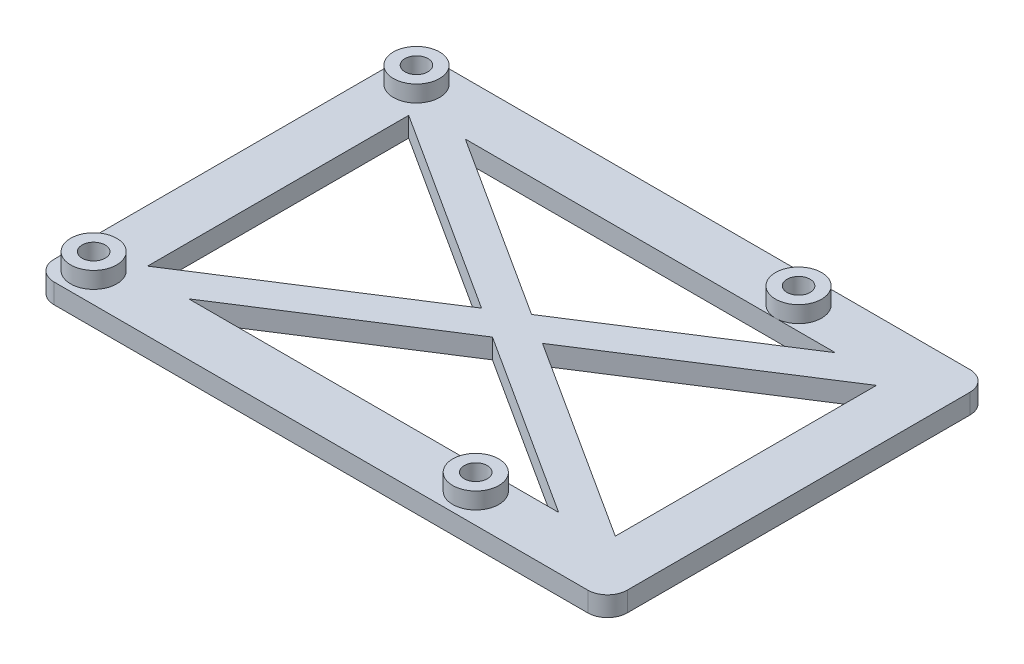
ISO-10303-21;
HEADER;
FILE_DESCRIPTION(('STEP AP214'),'2;1');
FILE_NAME('part.step','',(''),(''),'','','');
FILE_SCHEMA(('AUTOMOTIVE_DESIGN { 1 0 10303 214 1 1 1 1 }'));
ENDSEC;
DATA;
#1=APPLICATION_CONTEXT('core data for automotive mechanical design processes');
#2=APPLICATION_PROTOCOL_DEFINITION('international standard','automotive_design',2000,#1);
#3=PRODUCT_CONTEXT('',#1,'mechanical');
#4=PRODUCT('Part','Part','',(#3));
#5=PRODUCT_RELATED_PRODUCT_CATEGORY('part','',(#4));
#6=PRODUCT_DEFINITION_FORMATION('','',#4);
#7=PRODUCT_DEFINITION_CONTEXT('part definition',#1,'design');
#8=PRODUCT_DEFINITION('design','',#6,#7);
#9=PRODUCT_DEFINITION_SHAPE('','',#8);
#10=(LENGTH_UNIT() NAMED_UNIT(*) SI_UNIT(.MILLI.,.METRE.));
#11=(NAMED_UNIT(*) PLANE_ANGLE_UNIT() SI_UNIT($,.RADIAN.));
#12=(NAMED_UNIT(*) SI_UNIT($,.STERADIAN.) SOLID_ANGLE_UNIT());
#13=UNCERTAINTY_MEASURE_WITH_UNIT(LENGTH_MEASURE(1.E-05),#10,'distance_accuracy_value','');
#14=(GEOMETRIC_REPRESENTATION_CONTEXT(3) GLOBAL_UNCERTAINTY_ASSIGNED_CONTEXT((#13)) GLOBAL_UNIT_ASSIGNED_CONTEXT((#10,
#11,#12)) REPRESENTATION_CONTEXT('',''));
#15=CARTESIAN_POINT('',(0.,0.,0.));
#16=DIRECTION('',(0.,0.,1.));
#17=DIRECTION('',(1.,0.,0.));
#18=AXIS2_PLACEMENT_3D('',#15,#16,#17);
#19=CARTESIAN_POINT('',(-43.5,3.,29.));
#20=DIRECTION('',(1.,0.,0.));
#21=DIRECTION('',(0.,0.,-1.));
#22=AXIS2_PLACEMENT_3D('',#19,#20,#21);
#23=PLANE('',#22);
#24=DIRECTION('',(0.,0.,1.));
#25=VECTOR('',#24,1.);
#26=CARTESIAN_POINT('',(-43.5,3.,29.));
#27=LINE('',#26,#25);
#28=CARTESIAN_POINT('',(-43.5,3.,-26.));
#29=VERTEX_POINT('',#28);
#30=CARTESIAN_POINT('',(-43.5,3.,26.));
#31=VERTEX_POINT('',#30);
#32=EDGE_CURVE('E378',#29,#31,#27,.T.);
#33=ORIENTED_EDGE('',*,*,#32,.F.);
#34=DIRECTION('',(0.,-1.,0.));
#35=VECTOR('',#34,1.);
#36=CARTESIAN_POINT('',(-43.5,3.,-26.));
#37=LINE('',#36,#35);
#38=CARTESIAN_POINT('',(-43.5,0.,-26.));
#39=VERTEX_POINT('',#38);
#40=EDGE_CURVE('E416',#29,#39,#37,.T.);
#41=ORIENTED_EDGE('',*,*,#40,.T.);
#42=DIRECTION('',(0.,0.,1.));
#43=VECTOR('',#42,1.);
#44=CARTESIAN_POINT('',(-43.5,0.,29.));
#45=LINE('',#44,#43);
#46=CARTESIAN_POINT('',(-43.5,0.,26.));
#47=VERTEX_POINT('',#46);
#48=EDGE_CURVE('E380',#39,#47,#45,.T.);
#49=ORIENTED_EDGE('',*,*,#48,.T.);
#50=DIRECTION('',(0.,-1.,0.));
#51=VECTOR('',#50,1.);
#52=CARTESIAN_POINT('',(-43.5,3.,26.));
#53=LINE('',#52,#51);
#54=EDGE_CURVE('E414',#47,#31,#53,.F.);
#55=ORIENTED_EDGE('',*,*,#54,.T.);
#56=EDGE_LOOP('',(#33,#41,#49,#55));
#57=FACE_BOUND('',#56,.T.);
#58=ADVANCED_FACE('F50',(#57),#23,.F.);
#59=CARTESIAN_POINT('',(43.5,3.,29.));
#60=DIRECTION('',(0.,0.,-1.));
#61=DIRECTION('',(-1.,0.,0.));
#62=AXIS2_PLACEMENT_3D('',#59,#60,#61);
#63=PLANE('',#62);
#64=DIRECTION('',(1.,0.,0.));
#65=VECTOR('',#64,1.);
#66=CARTESIAN_POINT('',(43.5,3.,29.));
#67=LINE('',#66,#65);
#68=CARTESIAN_POINT('',(-40.5,3.,29.));
#69=VERTEX_POINT('',#68);
#70=CARTESIAN_POINT('',(40.5,3.,29.));
#71=VERTEX_POINT('',#70);
#72=EDGE_CURVE('E385',#69,#71,#67,.T.);
#73=ORIENTED_EDGE('',*,*,#72,.F.);
#74=DIRECTION('',(0.,-1.,0.));
#75=VECTOR('',#74,1.);
#76=CARTESIAN_POINT('',(-40.5,3.,29.));
#77=LINE('',#76,#75);
#78=CARTESIAN_POINT('',(-40.5,0.,29.));
#79=VERTEX_POINT('',#78);
#80=EDGE_CURVE('E457',#69,#79,#77,.T.);
#81=ORIENTED_EDGE('',*,*,#80,.T.);
#82=DIRECTION('',(1.,0.,0.));
#83=VECTOR('',#82,1.);
#84=CARTESIAN_POINT('',(43.5,0.,29.));
#85=LINE('',#84,#83);
#86=CARTESIAN_POINT('',(40.5,0.,29.));
#87=VERTEX_POINT('',#86);
#88=EDGE_CURVE('E400',#79,#87,#85,.T.);
#89=ORIENTED_EDGE('',*,*,#88,.T.);
#90=DIRECTION('',(0.,-1.,0.));
#91=VECTOR('',#90,1.);
#92=CARTESIAN_POINT('',(40.5,3.,29.));
#93=LINE('',#92,#91);
#94=EDGE_CURVE('E451',#87,#71,#93,.F.);
#95=ORIENTED_EDGE('',*,*,#94,.T.);
#96=EDGE_LOOP('',(#73,#81,#89,#95));
#97=FACE_BOUND('',#96,.T.);
#98=ADVANCED_FACE('F492',(#97),#63,.F.);
#99=CARTESIAN_POINT('',(43.5,3.,29.));
#100=DIRECTION('',(-1.,0.,0.));
#101=DIRECTION('',(0.,0.,1.));
#102=AXIS2_PLACEMENT_3D('',#99,#100,#101);
#103=PLANE('',#102);
#104=DIRECTION('',(0.,0.,-1.));
#105=VECTOR('',#104,1.);
#106=CARTESIAN_POINT('',(43.5,3.,29.));
#107=LINE('',#106,#105);
#108=CARTESIAN_POINT('',(43.5,3.,26.));
#109=VERTEX_POINT('',#108);
#110=CARTESIAN_POINT('',(43.5,3.,-26.));
#111=VERTEX_POINT('',#110);
#112=EDGE_CURVE('E390',#109,#111,#107,.T.);
#113=ORIENTED_EDGE('',*,*,#112,.F.);
#114=DIRECTION('',(0.,-1.,0.));
#115=VECTOR('',#114,1.);
#116=CARTESIAN_POINT('',(43.5,3.,26.));
#117=LINE('',#116,#115);
#118=CARTESIAN_POINT('',(43.5,0.,26.));
#119=VERTEX_POINT('',#118);
#120=EDGE_CURVE('E11',#109,#119,#117,.T.);
#121=ORIENTED_EDGE('',*,*,#120,.T.);
#122=DIRECTION('',(0.,0.,-1.));
#123=VECTOR('',#122,1.);
#124=CARTESIAN_POINT('',(43.5,0.,29.));
#125=LINE('',#124,#123);
#126=CARTESIAN_POINT('',(43.5,0.,-26.));
#127=VERTEX_POINT('',#126);
#128=EDGE_CURVE('E402',#119,#127,#125,.T.);
#129=ORIENTED_EDGE('',*,*,#128,.T.);
#130=DIRECTION('',(0.,-1.,0.));
#131=VECTOR('',#130,1.);
#132=CARTESIAN_POINT('',(43.5,3.,-26.));
#133=LINE('',#132,#131);
#134=EDGE_CURVE('E57',#127,#111,#133,.F.);
#135=ORIENTED_EDGE('',*,*,#134,.T.);
#136=EDGE_LOOP('',(#113,#121,#129,#135));
#137=FACE_BOUND('',#136,.T.);
#138=ADVANCED_FACE('F461',(#137),#103,.F.);
#139=CARTESIAN_POINT('',(43.5,3.,-29.));
#140=DIRECTION('',(0.,0.,1.));
#141=DIRECTION('',(1.,0.,0.));
#142=AXIS2_PLACEMENT_3D('',#139,#140,#141);
#143=PLANE('',#142);
#144=DIRECTION('',(-1.,0.,0.));
#145=VECTOR('',#144,1.);
#146=CARTESIAN_POINT('',(43.5,0.,-29.));
#147=LINE('',#146,#145);
#148=CARTESIAN_POINT('',(40.5,0.,-29.));
#149=VERTEX_POINT('',#148);
#150=CARTESIAN_POINT('',(-40.5,0.,-29.));
#151=VERTEX_POINT('',#150);
#152=EDGE_CURVE('E382',#149,#151,#147,.T.);
#153=ORIENTED_EDGE('',*,*,#152,.T.);
#154=DIRECTION('',(0.,-1.,0.));
#155=VECTOR('',#154,1.);
#156=CARTESIAN_POINT('',(-40.5,3.,-29.));
#157=LINE('',#156,#155);
#158=CARTESIAN_POINT('',(-40.5,3.,-29.));
#159=VERTEX_POINT('',#158);
#160=EDGE_CURVE('E437',#151,#159,#157,.F.);
#161=ORIENTED_EDGE('',*,*,#160,.T.);
#162=DIRECTION('',(-1.,0.,0.));
#163=VECTOR('',#162,1.);
#164=CARTESIAN_POINT('',(43.5,3.,-29.));
#165=LINE('',#164,#163);
#166=CARTESIAN_POINT('',(40.5,3.,-29.));
#167=VERTEX_POINT('',#166);
#168=EDGE_CURVE('E352',#167,#159,#165,.T.);
#169=ORIENTED_EDGE('',*,*,#168,.F.);
#170=DIRECTION('',(0.,-1.,0.));
#171=VECTOR('',#170,1.);
#172=CARTESIAN_POINT('',(40.5,3.,-29.));
#173=LINE('',#172,#171);
#174=EDGE_CURVE('E432',#167,#149,#173,.T.);
#175=ORIENTED_EDGE('',*,*,#174,.T.);
#176=EDGE_LOOP('',(#153,#161,#169,#175));
#177=FACE_BOUND('',#176,.T.);
#178=ADVANCED_FACE('F474',(#177),#143,.F.);
#179=CARTESIAN_POINT('',(0.,3.,0.));
#180=DIRECTION('',(0.,1.,0.));
#181=DIRECTION('',(0.,0.,1.));
#182=AXIS2_PLACEMENT_3D('',#179,#180,#181);
#183=PLANE('',#182);
#184=DIRECTION('',(0.841515862983257,0.,-0.540232405865795));
#185=VECTOR('',#184,1.);
#186=CARTESIAN_POINT('',(-1.3505810146645,3.,-2.10378965745816));
#187=LINE('',#186,#185);
#188=CARTESIAN_POINT('',(-35.5,3.,19.8192941355968));
#189=VERTEX_POINT('',#188);
#190=CARTESIAN_POINT('',(-4.62763798108969,3.,0.));
#191=VERTEX_POINT('',#190);
#192=EDGE_CURVE('E316',#189,#191,#187,.T.);
#193=ORIENTED_EDGE('',*,*,#192,.F.);
#194=DIRECTION('',(0.,0.,1.));
#195=VECTOR('',#194,1.);
#196=CARTESIAN_POINT('',(-35.5,3.,0.));
#197=LINE('',#196,#195);
#198=CARTESIAN_POINT('',(-35.5,3.,-19.8192941355968));
#199=VERTEX_POINT('',#198);
#200=EDGE_CURVE('E309',#199,#189,#197,.T.);
#201=ORIENTED_EDGE('',*,*,#200,.F.);
#202=DIRECTION('',(-0.841515862983257,0.,-0.540232405865794));
#203=VECTOR('',#202,1.);
#204=CARTESIAN_POINT('',(-1.35058101466449,3.,2.10378965745814));
#205=LINE('',#204,#203);
#206=EDGE_CURVE('E311',#191,#199,#205,.T.);
#207=ORIENTED_EDGE('',*,*,#206,.F.);
#208=EDGE_LOOP('',(#193,#201,#207));
#209=FACE_BOUND('',#208,.T.);
#210=DIRECTION('',(-1.,0.,0.));
#211=VECTOR('',#210,1.);
#212=CARTESIAN_POINT('',(0.,3.,-21.));
#213=LINE('',#212,#211);
#214=CARTESIAN_POINT('',(28.0839004804488,3.,-21.));
#215=VERTEX_POINT('',#214);
#216=CARTESIAN_POINT('',(19.,3.,-21.));
#217=VERTEX_POINT('',#216);
#218=EDGE_CURVE('E286',#215,#217,#213,.T.);
#219=ORIENTED_EDGE('',*,*,#218,.F.);
#220=DIRECTION('',(0.841515862983257,0.,-0.540232405865795));
#221=VECTOR('',#220,1.);
#222=CARTESIAN_POINT('',(-1.35058101466449,3.,-2.10378965745815));
#223=LINE('',#222,#221);
#224=CARTESIAN_POINT('',(0.,3.,-2.97082932119338));
#225=VERTEX_POINT('',#224);
#226=EDGE_CURVE('E302',#225,#215,#223,.T.);
#227=ORIENTED_EDGE('',*,*,#226,.F.);
#228=DIRECTION('',(0.841515862983257,0.,0.540232405865794));
#229=VECTOR('',#228,1.);
#230=CARTESIAN_POINT('',(1.35058101466449,3.,-2.10378965745815));
#231=LINE('',#230,#229);
#232=CARTESIAN_POINT('',(-28.0839004804488,3.,-21.));
#233=VERTEX_POINT('',#232);
#234=EDGE_CURVE('E307',#233,#225,#231,.T.);
#235=ORIENTED_EDGE('',*,*,#234,.F.);
#236=EDGE_CURVE('E282',#217,#233,#213,.T.);
#237=ORIENTED_EDGE('',*,*,#236,.F.);
#238=CARTESIAN_POINT('',(19.,3.,-24.5));
#239=DIRECTION('',(0.,1.,0.));
#240=DIRECTION('',(0.,0.,1.));
#241=AXIS2_PLACEMENT_3D('',#238,#239,#240);
#242=CIRCLE('',#241,3.5);
#243=EDGE_CURVE('E353',#217,#217,#242,.T.);
#244=ORIENTED_EDGE('',*,*,#243,.F.);
#245=EDGE_LOOP('',(#219,#227,#235,#237,#244));
#246=FACE_BOUND('',#245,.T.);
#247=DIRECTION('',(-0.841515862983257,0.,0.540232405865794));
#248=VECTOR('',#247,1.);
#249=CARTESIAN_POINT('',(1.35058101466448,3.,2.10378965745813));
#250=LINE('',#249,#248);
#251=CARTESIAN_POINT('',(35.5,3.,-19.8192941355967));
#252=VERTEX_POINT('',#251);
#253=CARTESIAN_POINT('',(4.62763798108965,3.,0.));
#254=VERTEX_POINT('',#253);
#255=EDGE_CURVE('E196',#252,#254,#250,.T.);
#256=ORIENTED_EDGE('',*,*,#255,.F.);
#257=DIRECTION('',(0.,0.,-1.));
#258=VECTOR('',#257,1.);
#259=CARTESIAN_POINT('',(35.5,3.,0.));
#260=LINE('',#259,#258);
#261=CARTESIAN_POINT('',(35.5,3.,19.8192941355967));
#262=VERTEX_POINT('',#261);
#263=EDGE_CURVE('E298',#262,#252,#260,.T.);
#264=ORIENTED_EDGE('',*,*,#263,.F.);
#265=DIRECTION('',(0.841515862983257,0.,0.540232405865794));
#266=VECTOR('',#265,1.);
#267=CARTESIAN_POINT('',(1.35058101466448,3.,-2.10378965745814));
#268=LINE('',#267,#266);
#269=EDGE_CURVE('E299',#254,#262,#268,.T.);
#270=ORIENTED_EDGE('',*,*,#269,.F.);
#271=EDGE_LOOP('',(#256,#264,#270));
#272=FACE_BOUND('',#271,.T.);
#273=DIRECTION('',(1.,0.,0.));
#274=VECTOR('',#273,1.);
#275=CARTESIAN_POINT('',(0.,3.,21.));
#276=LINE('',#275,#274);
#277=CARTESIAN_POINT('',(-28.0839004804488,3.,21.));
#278=VERTEX_POINT('',#277);
#279=CARTESIAN_POINT('',(19.,3.,21.));
#280=VERTEX_POINT('',#279);
#281=EDGE_CURVE('E284',#278,#280,#276,.T.);
#282=ORIENTED_EDGE('',*,*,#281,.F.);
#283=DIRECTION('',(-0.841515862983257,0.,0.540232405865795));
#284=VECTOR('',#283,1.);
#285=CARTESIAN_POINT('',(1.35058101466449,3.,2.10378965745815));
#286=LINE('',#285,#284);
#287=CARTESIAN_POINT('',(0.,3.,2.97082932119337));
#288=VERTEX_POINT('',#287);
#289=EDGE_CURVE('E287',#288,#278,#286,.T.);
#290=ORIENTED_EDGE('',*,*,#289,.F.);
#291=DIRECTION('',(-0.841515862983257,0.,-0.540232405865795));
#292=VECTOR('',#291,1.);
#293=CARTESIAN_POINT('',(-1.35058101466448,3.,2.10378965745813));
#294=LINE('',#293,#292);
#295=CARTESIAN_POINT('',(28.0839004804488,3.,21.));
#296=VERTEX_POINT('',#295);
#297=EDGE_CURVE('E295',#296,#288,#294,.T.);
#298=ORIENTED_EDGE('',*,*,#297,.F.);
#299=EDGE_CURVE('E274',#280,#296,#276,.T.);
#300=ORIENTED_EDGE('',*,*,#299,.F.);
#301=CARTESIAN_POINT('',(19.,3.,24.5));
#302=DIRECTION('',(0.,1.,0.));
#303=DIRECTION('',(0.,0.,1.));
#304=AXIS2_PLACEMENT_3D('',#301,#302,#303);
#305=CIRCLE('',#304,3.5);
#306=EDGE_CURVE('E348',#280,#280,#305,.T.);
#307=ORIENTED_EDGE('',*,*,#306,.F.);
#308=EDGE_LOOP('',(#282,#290,#298,#300,#307));
#309=FACE_BOUND('',#308,.T.);
#310=CARTESIAN_POINT('',(-39.,3.,24.5));
#311=DIRECTION('',(0.,1.,0.));
#312=DIRECTION('',(0.,0.,1.));
#313=AXIS2_PLACEMENT_3D('',#310,#311,#312);
#314=CIRCLE('',#313,3.5);
#315=CARTESIAN_POINT('',(-39.,3.,28.));
#316=VERTEX_POINT('',#315);
#317=EDGE_CURVE('E413',#316,#316,#314,.T.);
#318=ORIENTED_EDGE('',*,*,#317,.F.);
#319=EDGE_LOOP('',(#318));
#320=FACE_BOUND('',#319,.T.);
#321=CARTESIAN_POINT('',(-39.,3.,-24.5));
#322=DIRECTION('',(0.,1.,0.));
#323=DIRECTION('',(0.,0.,1.));
#324=AXIS2_PLACEMENT_3D('',#321,#322,#323);
#325=CIRCLE('',#324,3.5);
#326=CARTESIAN_POINT('',(-39.,3.,-21.));
#327=VERTEX_POINT('',#326);
#328=EDGE_CURVE('E347',#327,#327,#325,.T.);
#329=ORIENTED_EDGE('',*,*,#328,.F.);
#330=EDGE_LOOP('',(#329));
#331=FACE_BOUND('',#330,.T.);
#332=ORIENTED_EDGE('',*,*,#168,.T.);
#333=CARTESIAN_POINT('',(-40.5,3.,-26.));
#334=DIRECTION('',(0.,1.,0.));
#335=DIRECTION('',(0.,0.,1.));
#336=AXIS2_PLACEMENT_3D('',#333,#334,#335);
#337=CIRCLE('',#336,3.);
#338=EDGE_CURVE('E447',#159,#29,#337,.T.);
#339=ORIENTED_EDGE('',*,*,#338,.T.);
#340=ORIENTED_EDGE('',*,*,#32,.T.);
#341=CARTESIAN_POINT('',(-40.5,3.,26.));
#342=DIRECTION('',(0.,1.,0.));
#343=DIRECTION('',(0.,0.,1.));
#344=AXIS2_PLACEMENT_3D('',#341,#342,#343);
#345=CIRCLE('',#344,3.);
#346=EDGE_CURVE('E450',#31,#69,#345,.T.);
#347=ORIENTED_EDGE('',*,*,#346,.T.);
#348=ORIENTED_EDGE('',*,*,#72,.T.);
#349=CARTESIAN_POINT('',(40.5,3.,26.));
#350=DIRECTION('',(0.,1.,0.));
#351=DIRECTION('',(0.,0.,1.));
#352=AXIS2_PLACEMENT_3D('',#349,#350,#351);
#353=CIRCLE('',#352,3.);
#354=EDGE_CURVE('E441',#71,#109,#353,.T.);
#355=ORIENTED_EDGE('',*,*,#354,.T.);
#356=ORIENTED_EDGE('',*,*,#112,.T.);
#357=CARTESIAN_POINT('',(40.5,3.,-26.));
#358=DIRECTION('',(0.,1.,0.));
#359=DIRECTION('',(0.,0.,1.));
#360=AXIS2_PLACEMENT_3D('',#357,#358,#359);
#361=CIRCLE('',#360,3.);
#362=EDGE_CURVE('E442',#111,#167,#361,.T.);
#363=ORIENTED_EDGE('',*,*,#362,.T.);
#364=EDGE_LOOP('',(#332,#339,#340,#347,#348,#355,#356,#363));
#365=FACE_BOUND('',#364,.T.);
#366=ADVANCED_FACE('F467',(#209,#246,#272,#309,#320,#331,#365),#183,.T.);
#367=CARTESIAN_POINT('',(0.,0.,0.));
#368=DIRECTION('',(0.,1.,0.));
#369=DIRECTION('',(0.,0.,1.));
#370=AXIS2_PLACEMENT_3D('',#367,#368,#369);
#371=PLANE('',#370);
#372=DIRECTION('',(0.,0.,-1.));
#373=VECTOR('',#372,1.);
#374=CARTESIAN_POINT('',(-35.5,0.,-19.8192941355968));
#375=LINE('',#374,#373);
#376=CARTESIAN_POINT('',(-35.5,0.,19.8192941355968));
#377=VERTEX_POINT('',#376);
#378=CARTESIAN_POINT('',(-35.5,0.,-19.8192941355968));
#379=VERTEX_POINT('',#378);
#380=EDGE_CURVE('E234',#377,#379,#375,.T.);
#381=ORIENTED_EDGE('',*,*,#380,.F.);
#382=DIRECTION('',(-0.841515862983257,0.,0.540232405865795));
#383=VECTOR('',#382,1.);
#384=CARTESIAN_POINT('',(-35.5,0.,19.8192941355968));
#385=LINE('',#384,#383);
#386=CARTESIAN_POINT('',(-4.62763798108969,0.,0.));
#387=VERTEX_POINT('',#386);
#388=EDGE_CURVE('E236',#387,#377,#385,.T.);
#389=ORIENTED_EDGE('',*,*,#388,.F.);
#390=DIRECTION('',(0.841515862983257,0.,0.540232405865794));
#391=VECTOR('',#390,1.);
#392=CARTESIAN_POINT('',(-4.62763798108969,0.,0.));
#393=LINE('',#392,#391);
#394=EDGE_CURVE('E229',#379,#387,#393,.T.);
#395=ORIENTED_EDGE('',*,*,#394,.F.);
#396=EDGE_LOOP('',(#381,#389,#395));
#397=FACE_BOUND('',#396,.T.);
#398=DIRECTION('',(-0.841515862983257,0.,0.540232405865795));
#399=VECTOR('',#398,1.);
#400=CARTESIAN_POINT('',(0.,0.,-2.97082932119338));
#401=LINE('',#400,#399);
#402=CARTESIAN_POINT('',(28.0839004804488,0.,-21.));
#403=VERTEX_POINT('',#402);
#404=CARTESIAN_POINT('',(0.,0.,-2.97082932119338));
#405=VERTEX_POINT('',#404);
#406=EDGE_CURVE('E255',#403,#405,#401,.T.);
#407=ORIENTED_EDGE('',*,*,#406,.F.);
#408=DIRECTION('',(1.,0.,0.));
#409=VECTOR('',#408,1.);
#410=CARTESIAN_POINT('',(28.0839004804488,0.,-21.));
#411=LINE('',#410,#409);
#412=CARTESIAN_POINT('',(-28.0839004804488,0.,-21.));
#413=VERTEX_POINT('',#412);
#414=EDGE_CURVE('E260',#413,#403,#411,.T.);
#415=ORIENTED_EDGE('',*,*,#414,.F.);
#416=DIRECTION('',(-0.841515862983257,0.,-0.540232405865795));
#417=VECTOR('',#416,1.);
#418=CARTESIAN_POINT('',(0.,0.,-2.97082932119338));
#419=LINE('',#418,#417);
#420=EDGE_CURVE('E248',#405,#413,#419,.T.);
#421=ORIENTED_EDGE('',*,*,#420,.F.);
#422=EDGE_LOOP('',(#407,#415,#421));
#423=FACE_BOUND('',#422,.T.);
#424=DIRECTION('',(0.,0.,1.));
#425=VECTOR('',#424,1.);
#426=CARTESIAN_POINT('',(35.5,0.,19.8192941355967));
#427=LINE('',#426,#425);
#428=CARTESIAN_POINT('',(35.5,0.,-19.8192941355967));
#429=VERTEX_POINT('',#428);
#430=CARTESIAN_POINT('',(35.5,0.,19.8192941355967));
#431=VERTEX_POINT('',#430);
#432=EDGE_CURVE('E215',#429,#431,#427,.T.);
#433=ORIENTED_EDGE('',*,*,#432,.F.);
#434=DIRECTION('',(0.841515862983257,0.,-0.540232405865794));
#435=VECTOR('',#434,1.);
#436=CARTESIAN_POINT('',(4.62763798108965,0.,0.));
#437=LINE('',#436,#435);
#438=CARTESIAN_POINT('',(4.62763798108965,0.,0.));
#439=VERTEX_POINT('',#438);
#440=EDGE_CURVE('E194',#439,#429,#437,.T.);
#441=ORIENTED_EDGE('',*,*,#440,.F.);
#442=DIRECTION('',(-0.841515862983257,0.,-0.540232405865794));
#443=VECTOR('',#442,1.);
#444=CARTESIAN_POINT('',(35.5,0.,19.8192941355967));
#445=LINE('',#444,#443);
#446=EDGE_CURVE('E206',#431,#439,#445,.T.);
#447=ORIENTED_EDGE('',*,*,#446,.F.);
#448=EDGE_LOOP('',(#433,#441,#447));
#449=FACE_BOUND('',#448,.T.);
#450=DIRECTION('',(0.841515862983257,0.,-0.540232405865795));
#451=VECTOR('',#450,1.);
#452=CARTESIAN_POINT('',(-28.0839004804488,0.,21.));
#453=LINE('',#452,#451);
#454=CARTESIAN_POINT('',(-28.0839004804488,0.,21.));
#455=VERTEX_POINT('',#454);
#456=CARTESIAN_POINT('',(0.,0.,2.97082932119337));
#457=VERTEX_POINT('',#456);
#458=EDGE_CURVE('E263',#455,#457,#453,.T.);
#459=ORIENTED_EDGE('',*,*,#458,.F.);
#460=DIRECTION('',(-1.,0.,0.));
#461=VECTOR('',#460,1.);
#462=CARTESIAN_POINT('',(-28.0839004804488,0.,21.));
#463=LINE('',#462,#461);
#464=CARTESIAN_POINT('',(28.0839004804488,0.,21.));
#465=VERTEX_POINT('',#464);
#466=EDGE_CURVE('E257',#465,#455,#463,.T.);
#467=ORIENTED_EDGE('',*,*,#466,.F.);
#468=DIRECTION('',(0.841515862983257,0.,0.540232405865795));
#469=VECTOR('',#468,1.);
#470=CARTESIAN_POINT('',(28.0839004804488,0.,21.));
#471=LINE('',#470,#469);
#472=EDGE_CURVE('E270',#457,#465,#471,.T.);
#473=ORIENTED_EDGE('',*,*,#472,.F.);
#474=EDGE_LOOP('',(#459,#467,#473));
#475=FACE_BOUND('',#474,.T.);
#476=CARTESIAN_POINT('',(19.,0.,-24.5));
#477=DIRECTION('',(0.,-1.,0.));
#478=DIRECTION('',(0.,0.,-1.));
#479=AXIS2_PLACEMENT_3D('',#476,#477,#478);
#480=CIRCLE('',#479,1.75);
#481=CARTESIAN_POINT('',(19.,0.,-26.25));
#482=VERTEX_POINT('',#481);
#483=EDGE_CURVE('E344',#482,#482,#480,.T.);
#484=ORIENTED_EDGE('',*,*,#483,.F.);
#485=EDGE_LOOP('',(#484));
#486=FACE_BOUND('',#485,.T.);
#487=CARTESIAN_POINT('',(19.,0.,24.5));
#488=DIRECTION('',(0.,-1.,0.));
#489=DIRECTION('',(0.,0.,-1.));
#490=AXIS2_PLACEMENT_3D('',#487,#488,#489);
#491=CIRCLE('',#490,1.75);
#492=CARTESIAN_POINT('',(19.,0.,22.75));
#493=VERTEX_POINT('',#492);
#494=EDGE_CURVE('E370',#493,#493,#491,.T.);
#495=ORIENTED_EDGE('',*,*,#494,.F.);
#496=EDGE_LOOP('',(#495));
#497=FACE_BOUND('',#496,.T.);
#498=CARTESIAN_POINT('',(-39.,0.,24.5));
#499=DIRECTION('',(0.,-1.,0.));
#500=DIRECTION('',(0.,0.,-1.));
#501=AXIS2_PLACEMENT_3D('',#498,#499,#500);
#502=CIRCLE('',#501,1.75);
#503=CARTESIAN_POINT('',(-39.,0.,22.75));
#504=VERTEX_POINT('',#503);
#505=EDGE_CURVE('E362',#504,#504,#502,.T.);
#506=ORIENTED_EDGE('',*,*,#505,.F.);
#507=EDGE_LOOP('',(#506));
#508=FACE_BOUND('',#507,.T.);
#509=CARTESIAN_POINT('',(-39.,0.,-24.5));
#510=DIRECTION('',(0.,-1.,0.));
#511=DIRECTION('',(0.,0.,-1.));
#512=AXIS2_PLACEMENT_3D('',#509,#510,#511);
#513=CIRCLE('',#512,1.75);
#514=CARTESIAN_POINT('',(-39.,0.,-26.25));
#515=VERTEX_POINT('',#514);
#516=EDGE_CURVE('E368',#515,#515,#513,.T.);
#517=ORIENTED_EDGE('',*,*,#516,.F.);
#518=EDGE_LOOP('',(#517));
#519=FACE_BOUND('',#518,.T.);
#520=ORIENTED_EDGE('',*,*,#48,.F.);
#521=CARTESIAN_POINT('',(-40.5,0.,-26.));
#522=DIRECTION('',(0.,1.,0.));
#523=DIRECTION('',(0.,0.,1.));
#524=AXIS2_PLACEMENT_3D('',#521,#522,#523);
#525=CIRCLE('',#524,3.);
#526=EDGE_CURVE('E431',#39,#151,#525,.F.);
#527=ORIENTED_EDGE('',*,*,#526,.T.);
#528=ORIENTED_EDGE('',*,*,#152,.F.);
#529=CARTESIAN_POINT('',(40.5,0.,-26.));
#530=DIRECTION('',(0.,1.,0.));
#531=DIRECTION('',(0.,0.,1.));
#532=AXIS2_PLACEMENT_3D('',#529,#530,#531);
#533=CIRCLE('',#532,3.);
#534=EDGE_CURVE('E425',#149,#127,#533,.F.);
#535=ORIENTED_EDGE('',*,*,#534,.T.);
#536=ORIENTED_EDGE('',*,*,#128,.F.);
#537=CARTESIAN_POINT('',(40.5,0.,26.));
#538=DIRECTION('',(0.,1.,0.));
#539=DIRECTION('',(0.,0.,1.));
#540=AXIS2_PLACEMENT_3D('',#537,#538,#539);
#541=CIRCLE('',#540,3.);
#542=EDGE_CURVE('E422',#119,#87,#541,.F.);
#543=ORIENTED_EDGE('',*,*,#542,.T.);
#544=ORIENTED_EDGE('',*,*,#88,.F.);
#545=CARTESIAN_POINT('',(-40.5,0.,26.));
#546=DIRECTION('',(0.,1.,0.));
#547=DIRECTION('',(0.,0.,1.));
#548=AXIS2_PLACEMENT_3D('',#545,#546,#547);
#549=CIRCLE('',#548,3.);
#550=EDGE_CURVE('E428',#79,#47,#549,.F.);
#551=ORIENTED_EDGE('',*,*,#550,.T.);
#552=EDGE_LOOP('',(#520,#527,#528,#535,#536,#543,#544,#551));
#553=FACE_BOUND('',#552,.T.);
#554=ADVANCED_FACE('F214',(#397,#423,#449,#475,#486,#497,#508,#519,#553),#371,.F.);
#555=CARTESIAN_POINT('',(-39.,3.,-24.5));
#556=DIRECTION('',(0.,-1.,0.));
#557=DIRECTION('',(0.,0.,-1.));
#558=AXIS2_PLACEMENT_3D('',#555,#556,#557);
#559=CYLINDRICAL_SURFACE('',#558,1.75);
#560=ORIENTED_EDGE('',*,*,#516,.T.);
#561=EDGE_LOOP('',(#560));
#562=FACE_BOUND('',#561,.T.);
#563=CARTESIAN_POINT('',(-39.,5.5,-24.5));
#564=DIRECTION('',(0.,1.,0.));
#565=DIRECTION('',(0.,0.,1.));
#566=AXIS2_PLACEMENT_3D('',#563,#564,#565);
#567=CIRCLE('',#566,1.75);
#568=CARTESIAN_POINT('',(-39.,5.5,-22.75));
#569=VERTEX_POINT('',#568);
#570=EDGE_CURVE('E338',#569,#569,#567,.T.);
#571=ORIENTED_EDGE('',*,*,#570,.T.);
#572=EDGE_LOOP('',(#571));
#573=FACE_BOUND('',#572,.T.);
#574=ADVANCED_FACE('F559',(#562,#573),#559,.F.);
#575=CARTESIAN_POINT('',(-39.,3.,24.5));
#576=DIRECTION('',(0.,-1.,0.));
#577=DIRECTION('',(0.,0.,-1.));
#578=AXIS2_PLACEMENT_3D('',#575,#576,#577);
#579=CYLINDRICAL_SURFACE('',#578,1.75);
#580=ORIENTED_EDGE('',*,*,#505,.T.);
#581=EDGE_LOOP('',(#580));
#582=FACE_BOUND('',#581,.T.);
#583=CARTESIAN_POINT('',(-39.,5.5,24.5));
#584=DIRECTION('',(0.,-1.,0.));
#585=DIRECTION('',(0.,0.,-1.));
#586=AXIS2_PLACEMENT_3D('',#583,#584,#585);
#587=CIRCLE('',#586,1.75);
#588=CARTESIAN_POINT('',(-39.,5.5,22.75));
#589=VERTEX_POINT('',#588);
#590=EDGE_CURVE('E319',#589,#589,#587,.T.);
#591=ORIENTED_EDGE('',*,*,#590,.F.);
#592=EDGE_LOOP('',(#591));
#593=FACE_BOUND('',#592,.T.);
#594=ADVANCED_FACE('F553',(#582,#593),#579,.F.);
#595=CARTESIAN_POINT('',(19.,3.,24.5));
#596=DIRECTION('',(0.,-1.,0.));
#597=DIRECTION('',(0.,0.,-1.));
#598=AXIS2_PLACEMENT_3D('',#595,#596,#597);
#599=CYLINDRICAL_SURFACE('',#598,1.75);
#600=ORIENTED_EDGE('',*,*,#494,.T.);
#601=EDGE_LOOP('',(#600));
#602=FACE_BOUND('',#601,.T.);
#603=CARTESIAN_POINT('',(19.,5.5,24.5));
#604=DIRECTION('',(0.,-1.,0.));
#605=DIRECTION('',(0.,0.,-1.));
#606=AXIS2_PLACEMENT_3D('',#603,#604,#605);
#607=CIRCLE('',#606,1.75);
#608=CARTESIAN_POINT('',(19.,5.5,22.75));
#609=VERTEX_POINT('',#608);
#610=EDGE_CURVE('E317',#609,#609,#607,.T.);
#611=ORIENTED_EDGE('',*,*,#610,.F.);
#612=EDGE_LOOP('',(#611));
#613=FACE_BOUND('',#612,.T.);
#614=ADVANCED_FACE('F556',(#602,#613),#599,.F.);
#615=CARTESIAN_POINT('',(19.,3.,-24.5));
#616=DIRECTION('',(0.,-1.,0.));
#617=DIRECTION('',(0.,0.,-1.));
#618=AXIS2_PLACEMENT_3D('',#615,#616,#617);
#619=CYLINDRICAL_SURFACE('',#618,1.75);
#620=ORIENTED_EDGE('',*,*,#483,.T.);
#621=EDGE_LOOP('',(#620));
#622=FACE_BOUND('',#621,.T.);
#623=CARTESIAN_POINT('',(19.,5.5,-24.5));
#624=DIRECTION('',(0.,1.,0.));
#625=DIRECTION('',(0.,0.,1.));
#626=AXIS2_PLACEMENT_3D('',#623,#624,#625);
#627=CIRCLE('',#626,1.75);
#628=CARTESIAN_POINT('',(19.,5.5,-22.75));
#629=VERTEX_POINT('',#628);
#630=EDGE_CURVE('E343',#629,#629,#627,.T.);
#631=ORIENTED_EDGE('',*,*,#630,.T.);
#632=EDGE_LOOP('',(#631));
#633=FACE_BOUND('',#632,.T.);
#634=ADVANCED_FACE('F554',(#622,#633),#619,.F.);
#635=CARTESIAN_POINT('',(19.,5.5,-24.5));
#636=DIRECTION('',(0.,1.,0.));
#637=DIRECTION('',(0.,0.,1.));
#638=AXIS2_PLACEMENT_3D('',#635,#636,#637);
#639=PLANE('',#638);
#640=CARTESIAN_POINT('',(19.,5.5,-24.5));
#641=DIRECTION('',(0.,1.,0.));
#642=DIRECTION('',(0.,0.,1.));
#643=AXIS2_PLACEMENT_3D('',#640,#641,#642);
#644=CIRCLE('',#643,3.5);
#645=CARTESIAN_POINT('',(19.,5.5,-21.));
#646=VERTEX_POINT('',#645);
#647=EDGE_CURVE('E328',#646,#646,#644,.T.);
#648=ORIENTED_EDGE('',*,*,#647,.T.);
#649=EDGE_LOOP('',(#648));
#650=FACE_BOUND('',#649,.T.);
#651=ORIENTED_EDGE('',*,*,#630,.F.);
#652=EDGE_LOOP('',(#651));
#653=FACE_BOUND('',#652,.T.);
#654=ADVANCED_FACE('F548',(#650,#653),#639,.T.);
#655=CARTESIAN_POINT('',(19.,5.5,-24.5));
#656=DIRECTION('',(0.,-1.,0.));
#657=DIRECTION('',(0.,0.,-1.));
#658=AXIS2_PLACEMENT_3D('',#655,#656,#657);
#659=CYLINDRICAL_SURFACE('',#658,3.5);
#660=ORIENTED_EDGE('',*,*,#243,.T.);
#661=EDGE_LOOP('',(#660));
#662=FACE_BOUND('',#661,.T.);
#663=ORIENTED_EDGE('',*,*,#647,.F.);
#664=EDGE_LOOP('',(#663));
#665=FACE_BOUND('',#664,.T.);
#666=ADVANCED_FACE('F545',(#662,#665),#659,.T.);
#667=CARTESIAN_POINT('',(-39.,5.5,-24.5));
#668=DIRECTION('',(0.,1.,0.));
#669=DIRECTION('',(0.,0.,1.));
#670=AXIS2_PLACEMENT_3D('',#667,#668,#669);
#671=PLANE('',#670);
#672=CARTESIAN_POINT('',(-39.,5.5,-24.5));
#673=DIRECTION('',(0.,1.,0.));
#674=DIRECTION('',(0.,0.,1.));
#675=AXIS2_PLACEMENT_3D('',#672,#673,#674);
#676=CIRCLE('',#675,3.5);
#677=CARTESIAN_POINT('',(-39.,5.5,-21.));
#678=VERTEX_POINT('',#677);
#679=EDGE_CURVE('E337',#678,#678,#676,.T.);
#680=ORIENTED_EDGE('',*,*,#679,.T.);
#681=EDGE_LOOP('',(#680));
#682=FACE_BOUND('',#681,.T.);
#683=ORIENTED_EDGE('',*,*,#570,.F.);
#684=EDGE_LOOP('',(#683));
#685=FACE_BOUND('',#684,.T.);
#686=ADVANCED_FACE('F537',(#682,#685),#671,.T.);
#687=CARTESIAN_POINT('',(-39.,5.5,-24.5));
#688=DIRECTION('',(0.,-1.,0.));
#689=DIRECTION('',(0.,0.,-1.));
#690=AXIS2_PLACEMENT_3D('',#687,#688,#689);
#691=CYLINDRICAL_SURFACE('',#690,3.5);
#692=ORIENTED_EDGE('',*,*,#679,.F.);
#693=EDGE_LOOP('',(#692));
#694=FACE_BOUND('',#693,.T.);
#695=ORIENTED_EDGE('',*,*,#328,.T.);
#696=EDGE_LOOP('',(#695));
#697=FACE_BOUND('',#696,.T.);
#698=ADVANCED_FACE('F540',(#694,#697),#691,.T.);
#699=CARTESIAN_POINT('',(19.,5.5,24.5));
#700=DIRECTION('',(0.,-1.,0.));
#701=DIRECTION('',(0.,0.,-1.));
#702=AXIS2_PLACEMENT_3D('',#699,#700,#701);
#703=CYLINDRICAL_SURFACE('',#702,3.5);
#704=CARTESIAN_POINT('',(19.,5.5,24.5));
#705=DIRECTION('',(0.,-1.,0.));
#706=DIRECTION('',(0.,0.,-1.));
#707=AXIS2_PLACEMENT_3D('',#704,#705,#706);
#708=CIRCLE('',#707,3.5);
#709=CARTESIAN_POINT('',(19.,5.5,21.));
#710=VERTEX_POINT('',#709);
#711=EDGE_CURVE('E324',#710,#710,#708,.T.);
#712=ORIENTED_EDGE('',*,*,#711,.T.);
#713=EDGE_LOOP('',(#712));
#714=FACE_BOUND('',#713,.T.);
#715=ORIENTED_EDGE('',*,*,#306,.T.);
#716=EDGE_LOOP('',(#715));
#717=FACE_BOUND('',#716,.T.);
#718=ADVANCED_FACE('F531',(#714,#717),#703,.T.);
#719=CARTESIAN_POINT('',(19.,5.5,24.5));
#720=DIRECTION('',(0.,1.,0.));
#721=DIRECTION('',(0.,0.,-1.));
#722=AXIS2_PLACEMENT_3D('',#719,#720,#721);
#723=PLANE('',#722);
#724=ORIENTED_EDGE('',*,*,#610,.T.);
#725=EDGE_LOOP('',(#724));
#726=FACE_BOUND('',#725,.T.);
#727=ORIENTED_EDGE('',*,*,#711,.F.);
#728=EDGE_LOOP('',(#727));
#729=FACE_BOUND('',#728,.T.);
#730=ADVANCED_FACE('F522',(#726,#729),#723,.T.);
#731=CARTESIAN_POINT('',(-39.,5.5,24.5));
#732=DIRECTION('',(0.,-1.,0.));
#733=DIRECTION('',(0.,0.,-1.));
#734=AXIS2_PLACEMENT_3D('',#731,#732,#733);
#735=CYLINDRICAL_SURFACE('',#734,3.5);
#736=CARTESIAN_POINT('',(-39.,5.5,24.5));
#737=DIRECTION('',(0.,-1.,0.));
#738=DIRECTION('',(0.,0.,-1.));
#739=AXIS2_PLACEMENT_3D('',#736,#737,#738);
#740=CIRCLE('',#739,3.5);
#741=CARTESIAN_POINT('',(-39.,5.5,21.));
#742=VERTEX_POINT('',#741);
#743=EDGE_CURVE('E322',#742,#742,#740,.T.);
#744=ORIENTED_EDGE('',*,*,#743,.T.);
#745=EDGE_LOOP('',(#744));
#746=FACE_BOUND('',#745,.T.);
#747=ORIENTED_EDGE('',*,*,#317,.T.);
#748=EDGE_LOOP('',(#747));
#749=FACE_BOUND('',#748,.T.);
#750=ADVANCED_FACE('F516',(#746,#749),#735,.T.);
#751=CARTESIAN_POINT('',(-39.,5.5,24.5));
#752=DIRECTION('',(0.,1.,0.));
#753=DIRECTION('',(0.,0.,-1.));
#754=AXIS2_PLACEMENT_3D('',#751,#752,#753);
#755=PLANE('',#754);
#756=ORIENTED_EDGE('',*,*,#590,.T.);
#757=EDGE_LOOP('',(#756));
#758=FACE_BOUND('',#757,.T.);
#759=ORIENTED_EDGE('',*,*,#743,.F.);
#760=EDGE_LOOP('',(#759));
#761=FACE_BOUND('',#760,.T.);
#762=ADVANCED_FACE('F514',(#758,#761),#755,.T.);
#763=CARTESIAN_POINT('',(-40.5,3.,-26.));
#764=DIRECTION('',(0.,-1.,0.));
#765=DIRECTION('',(0.,0.,-1.));
#766=AXIS2_PLACEMENT_3D('',#763,#764,#765);
#767=CYLINDRICAL_SURFACE('',#766,3.);
#768=ORIENTED_EDGE('',*,*,#338,.F.);
#769=ORIENTED_EDGE('',*,*,#160,.F.);
#770=ORIENTED_EDGE('',*,*,#526,.F.);
#771=ORIENTED_EDGE('',*,*,#40,.F.);
#772=EDGE_LOOP('',(#768,#769,#770,#771));
#773=FACE_BOUND('',#772,.T.);
#774=ADVANCED_FACE('F485',(#773),#767,.T.);
#775=CARTESIAN_POINT('',(-40.5,3.,26.));
#776=DIRECTION('',(0.,-1.,0.));
#777=DIRECTION('',(0.,0.,-1.));
#778=AXIS2_PLACEMENT_3D('',#775,#776,#777);
#779=CYLINDRICAL_SURFACE('',#778,3.);
#780=ORIENTED_EDGE('',*,*,#346,.F.);
#781=ORIENTED_EDGE('',*,*,#54,.F.);
#782=ORIENTED_EDGE('',*,*,#550,.F.);
#783=ORIENTED_EDGE('',*,*,#80,.F.);
#784=EDGE_LOOP('',(#780,#781,#782,#783));
#785=FACE_BOUND('',#784,.T.);
#786=ADVANCED_FACE('F489',(#785),#779,.T.);
#787=CARTESIAN_POINT('',(40.5,3.,26.));
#788=DIRECTION('',(0.,-1.,0.));
#789=DIRECTION('',(0.,0.,-1.));
#790=AXIS2_PLACEMENT_3D('',#787,#788,#789);
#791=CYLINDRICAL_SURFACE('',#790,3.);
#792=ORIENTED_EDGE('',*,*,#354,.F.);
#793=ORIENTED_EDGE('',*,*,#94,.F.);
#794=ORIENTED_EDGE('',*,*,#542,.F.);
#795=ORIENTED_EDGE('',*,*,#120,.F.);
#796=EDGE_LOOP('',(#792,#793,#794,#795));
#797=FACE_BOUND('',#796,.T.);
#798=ADVANCED_FACE('F497',(#797),#791,.T.);
#799=CARTESIAN_POINT('',(40.5,3.,-26.));
#800=DIRECTION('',(0.,-1.,0.));
#801=DIRECTION('',(0.,0.,-1.));
#802=AXIS2_PLACEMENT_3D('',#799,#800,#801);
#803=CYLINDRICAL_SURFACE('',#802,3.);
#804=ORIENTED_EDGE('',*,*,#362,.F.);
#805=ORIENTED_EDGE('',*,*,#134,.F.);
#806=ORIENTED_EDGE('',*,*,#534,.F.);
#807=ORIENTED_EDGE('',*,*,#174,.F.);
#808=EDGE_LOOP('',(#804,#805,#806,#807));
#809=FACE_BOUND('',#808,.T.);
#810=ADVANCED_FACE('F47',(#809),#803,.T.);
#811=CARTESIAN_POINT('',(-28.0839004804488,5.5,21.));
#812=DIRECTION('',(0.,0.,1.));
#813=DIRECTION('',(1.,0.,0.));
#814=AXIS2_PLACEMENT_3D('',#811,#812,#813);
#815=PLANE('',#814);
#816=ORIENTED_EDGE('',*,*,#281,.T.);
#817=ORIENTED_EDGE('',*,*,#299,.T.);
#818=DIRECTION('',(0.,-1.,0.));
#819=VECTOR('',#818,1.);
#820=CARTESIAN_POINT('',(28.0839004804488,5.5,21.));
#821=LINE('',#820,#819);
#822=EDGE_CURVE('E275',#296,#465,#821,.T.);
#823=ORIENTED_EDGE('',*,*,#822,.T.);
#824=ORIENTED_EDGE('',*,*,#466,.T.);
#825=DIRECTION('',(0.,-1.,0.));
#826=VECTOR('',#825,1.);
#827=CARTESIAN_POINT('',(-28.0839004804488,5.5,21.));
#828=LINE('',#827,#826);
#829=EDGE_CURVE('E271',#278,#455,#828,.T.);
#830=ORIENTED_EDGE('',*,*,#829,.F.);
#831=EDGE_LOOP('',(#816,#817,#823,#824,#830));
#832=FACE_BOUND('',#831,.T.);
#833=ADVANCED_FACE('F505',(#832),#815,.F.);
#834=CARTESIAN_POINT('',(28.0839004804488,5.5,21.));
#835=DIRECTION('',(0.540232405865795,0.,-0.841515862983257));
#836=DIRECTION('',(-0.841515862983257,0.,-0.540232405865795));
#837=AXIS2_PLACEMENT_3D('',#834,#835,#836);
#838=PLANE('',#837);
#839=ORIENTED_EDGE('',*,*,#297,.T.);
#840=DIRECTION('',(0.,-1.,0.));
#841=VECTOR('',#840,1.);
#842=CARTESIAN_POINT('',(0.,5.5,2.97082932119337));
#843=LINE('',#842,#841);
#844=EDGE_CURVE('E277',#288,#457,#843,.T.);
#845=ORIENTED_EDGE('',*,*,#844,.T.);
#846=ORIENTED_EDGE('',*,*,#472,.T.);
#847=ORIENTED_EDGE('',*,*,#822,.F.);
#848=EDGE_LOOP('',(#839,#845,#846,#847));
#849=FACE_BOUND('',#848,.T.);
#850=ADVANCED_FACE('F703',(#849),#838,.F.);
#851=CARTESIAN_POINT('',(-28.0839004804488,5.5,21.));
#852=DIRECTION('',(-0.540232405865795,0.,-0.841515862983257));
#853=DIRECTION('',(-0.841515862983257,0.,0.540232405865795));
#854=AXIS2_PLACEMENT_3D('',#851,#852,#853);
#855=PLANE('',#854);
#856=ORIENTED_EDGE('',*,*,#289,.T.);
#857=ORIENTED_EDGE('',*,*,#829,.T.);
#858=ORIENTED_EDGE('',*,*,#458,.T.);
#859=ORIENTED_EDGE('',*,*,#844,.F.);
#860=EDGE_LOOP('',(#856,#857,#858,#859));
#861=FACE_BOUND('',#860,.T.);
#862=ADVANCED_FACE('F715',(#861),#855,.F.);
#863=CARTESIAN_POINT('',(4.62763798108965,5.5,0.));
#864=DIRECTION('',(-0.540232405865794,0.,-0.841515862983257));
#865=DIRECTION('',(-0.841515862983257,0.,0.540232405865794));
#866=AXIS2_PLACEMENT_3D('',#863,#864,#865);
#867=PLANE('',#866);
#868=ORIENTED_EDGE('',*,*,#255,.T.);
#869=DIRECTION('',(0.,-1.,0.));
#870=VECTOR('',#869,1.);
#871=CARTESIAN_POINT('',(4.62763798108965,5.5,0.));
#872=LINE('',#871,#870);
#873=EDGE_CURVE('E187',#254,#439,#872,.T.);
#874=ORIENTED_EDGE('',*,*,#873,.T.);
#875=ORIENTED_EDGE('',*,*,#440,.T.);
#876=DIRECTION('',(0.,-1.,0.));
#877=VECTOR('',#876,1.);
#878=CARTESIAN_POINT('',(35.5,5.5,-19.8192941355967));
#879=LINE('',#878,#877);
#880=EDGE_CURVE('E213',#252,#429,#879,.T.);
#881=ORIENTED_EDGE('',*,*,#880,.F.);
#882=EDGE_LOOP('',(#868,#874,#875,#881));
#883=FACE_BOUND('',#882,.T.);
#884=ADVANCED_FACE('F195',(#883),#867,.F.);
#885=CARTESIAN_POINT('',(35.5,5.5,19.8192941355967));
#886=DIRECTION('',(-0.540232405865794,0.,0.841515862983257));
#887=DIRECTION('',(0.841515862983257,0.,0.540232405865794));
#888=AXIS2_PLACEMENT_3D('',#885,#886,#887);
#889=PLANE('',#888);
#890=ORIENTED_EDGE('',*,*,#269,.T.);
#891=DIRECTION('',(0.,-1.,0.));
#892=VECTOR('',#891,1.);
#893=CARTESIAN_POINT('',(35.5,5.5,19.8192941355967));
#894=LINE('',#893,#892);
#895=EDGE_CURVE('E201',#262,#431,#894,.T.);
#896=ORIENTED_EDGE('',*,*,#895,.T.);
#897=ORIENTED_EDGE('',*,*,#446,.T.);
#898=ORIENTED_EDGE('',*,*,#873,.F.);
#899=EDGE_LOOP('',(#890,#896,#897,#898));
#900=FACE_BOUND('',#899,.T.);
#901=ADVANCED_FACE('F210',(#900),#889,.F.);
#902=CARTESIAN_POINT('',(35.5,5.5,19.8192941355967));
#903=DIRECTION('',(1.,0.,0.));
#904=DIRECTION('',(0.,0.,-1.));
#905=AXIS2_PLACEMENT_3D('',#902,#903,#904);
#906=PLANE('',#905);
#907=ORIENTED_EDGE('',*,*,#263,.T.);
#908=ORIENTED_EDGE('',*,*,#880,.T.);
#909=ORIENTED_EDGE('',*,*,#432,.T.);
#910=ORIENTED_EDGE('',*,*,#895,.F.);
#911=EDGE_LOOP('',(#907,#908,#909,#910));
#912=FACE_BOUND('',#911,.T.);
#913=ADVANCED_FACE('F736',(#912),#906,.F.);
#914=CARTESIAN_POINT('',(28.0839004804488,5.5,-21.));
#915=DIRECTION('',(0.,0.,-1.));
#916=DIRECTION('',(-1.,0.,0.));
#917=AXIS2_PLACEMENT_3D('',#914,#915,#916);
#918=PLANE('',#917);
#919=ORIENTED_EDGE('',*,*,#218,.T.);
#920=ORIENTED_EDGE('',*,*,#236,.T.);
#921=DIRECTION('',(0.,-1.,0.));
#922=VECTOR('',#921,1.);
#923=CARTESIAN_POINT('',(-28.0839004804488,5.5,-21.));
#924=LINE('',#923,#922);
#925=EDGE_CURVE('E243',#233,#413,#924,.T.);
#926=ORIENTED_EDGE('',*,*,#925,.T.);
#927=ORIENTED_EDGE('',*,*,#414,.T.);
#928=DIRECTION('',(0.,-1.,0.));
#929=VECTOR('',#928,1.);
#930=CARTESIAN_POINT('',(28.0839004804488,5.5,-21.));
#931=LINE('',#930,#929);
#932=EDGE_CURVE('E245',#215,#403,#931,.T.);
#933=ORIENTED_EDGE('',*,*,#932,.F.);
#934=EDGE_LOOP('',(#919,#920,#926,#927,#933));
#935=FACE_BOUND('',#934,.T.);
#936=ADVANCED_FACE('F747',(#935),#918,.F.);
#937=CARTESIAN_POINT('',(0.,5.5,-2.97082932119338));
#938=DIRECTION('',(-0.540232405865794,0.,0.841515862983257));
#939=DIRECTION('',(0.841515862983257,0.,0.540232405865794));
#940=AXIS2_PLACEMENT_3D('',#937,#938,#939);
#941=PLANE('',#940);
#942=ORIENTED_EDGE('',*,*,#234,.T.);
#943=DIRECTION('',(0.,-1.,0.));
#944=VECTOR('',#943,1.);
#945=CARTESIAN_POINT('',(0.,5.5,-2.97082932119338));
#946=LINE('',#945,#944);
#947=EDGE_CURVE('E72',#225,#405,#946,.T.);
#948=ORIENTED_EDGE('',*,*,#947,.T.);
#949=ORIENTED_EDGE('',*,*,#420,.T.);
#950=ORIENTED_EDGE('',*,*,#925,.F.);
#951=EDGE_LOOP('',(#942,#948,#949,#950));
#952=FACE_BOUND('',#951,.T.);
#953=ADVANCED_FACE('F760',(#952),#941,.F.);
#954=CARTESIAN_POINT('',(0.,5.5,-2.97082932119338));
#955=DIRECTION('',(0.540232405865795,0.,0.841515862983257));
#956=DIRECTION('',(0.841515862983257,0.,-0.540232405865795));
#957=AXIS2_PLACEMENT_3D('',#954,#955,#956);
#958=PLANE('',#957);
#959=ORIENTED_EDGE('',*,*,#226,.T.);
#960=ORIENTED_EDGE('',*,*,#932,.T.);
#961=ORIENTED_EDGE('',*,*,#406,.T.);
#962=ORIENTED_EDGE('',*,*,#947,.F.);
#963=EDGE_LOOP('',(#959,#960,#961,#962));
#964=FACE_BOUND('',#963,.T.);
#965=ADVANCED_FACE('F770',(#964),#958,.F.);
#966=CARTESIAN_POINT('',(-35.5,5.5,19.8192941355968));
#967=DIRECTION('',(0.540232405865795,0.,0.841515862983257));
#968=DIRECTION('',(0.841515862983257,0.,-0.540232405865795));
#969=AXIS2_PLACEMENT_3D('',#966,#967,#968);
#970=PLANE('',#969);
#971=ORIENTED_EDGE('',*,*,#192,.T.);
#972=DIRECTION('',(0.,-1.,0.));
#973=VECTOR('',#972,1.);
#974=CARTESIAN_POINT('',(-4.62763798108969,5.5,0.));
#975=LINE('',#974,#973);
#976=EDGE_CURVE('E217',#191,#387,#975,.T.);
#977=ORIENTED_EDGE('',*,*,#976,.T.);
#978=ORIENTED_EDGE('',*,*,#388,.T.);
#979=DIRECTION('',(0.,-1.,0.));
#980=VECTOR('',#979,1.);
#981=CARTESIAN_POINT('',(-35.5,5.5,19.8192941355968));
#982=LINE('',#981,#980);
#983=EDGE_CURVE('E223',#189,#377,#982,.T.);
#984=ORIENTED_EDGE('',*,*,#983,.F.);
#985=EDGE_LOOP('',(#971,#977,#978,#984));
#986=FACE_BOUND('',#985,.T.);
#987=ADVANCED_FACE('F780',(#986),#970,.F.);
#988=CARTESIAN_POINT('',(-4.62763798108969,5.5,0.));
#989=DIRECTION('',(0.540232405865794,0.,-0.841515862983257));
#990=DIRECTION('',(-0.841515862983257,0.,-0.540232405865794));
#991=AXIS2_PLACEMENT_3D('',#988,#989,#990);
#992=PLANE('',#991);
#993=ORIENTED_EDGE('',*,*,#206,.T.);
#994=DIRECTION('',(0.,-1.,0.));
#995=VECTOR('',#994,1.);
#996=CARTESIAN_POINT('',(-35.5,5.5,-19.8192941355968));
#997=LINE('',#996,#995);
#998=EDGE_CURVE('E61',#199,#379,#997,.T.);
#999=ORIENTED_EDGE('',*,*,#998,.T.);
#1000=ORIENTED_EDGE('',*,*,#394,.T.);
#1001=ORIENTED_EDGE('',*,*,#976,.F.);
#1002=EDGE_LOOP('',(#993,#999,#1000,#1001));
#1003=FACE_BOUND('',#1002,.T.);
#1004=ADVANCED_FACE('F787',(#1003),#992,.F.);
#1005=CARTESIAN_POINT('',(-35.5,5.5,-19.8192941355968));
#1006=DIRECTION('',(-1.,0.,0.));
#1007=DIRECTION('',(0.,0.,1.));
#1008=AXIS2_PLACEMENT_3D('',#1005,#1006,#1007);
#1009=PLANE('',#1008);
#1010=ORIENTED_EDGE('',*,*,#200,.T.);
#1011=ORIENTED_EDGE('',*,*,#983,.T.);
#1012=ORIENTED_EDGE('',*,*,#380,.T.);
#1013=ORIENTED_EDGE('',*,*,#998,.F.);
#1014=EDGE_LOOP('',(#1010,#1011,#1012,#1013));
#1015=FACE_BOUND('',#1014,.T.);
#1016=ADVANCED_FACE('F798',(#1015),#1009,.F.);
#1017=CLOSED_SHELL('',(#58,#98,#138,#178,#366,#554,#574,#594,#614,#634,#654,#666,#686,#698,#718,
#730,#750,#762,#774,#786,#798,#810,#833,#850,#862,#884,#901,#913,#936,#953,#965,#987,#1004,#1016));
#1018=MANIFOLD_SOLID_BREP('B2',#1017);
#1019=ADVANCED_BREP_SHAPE_REPRESENTATION('',(#18,#1018),#14);
#1020=SHAPE_DEFINITION_REPRESENTATION(#9,#1019);
ENDSEC;
END-ISO-10303-21;
